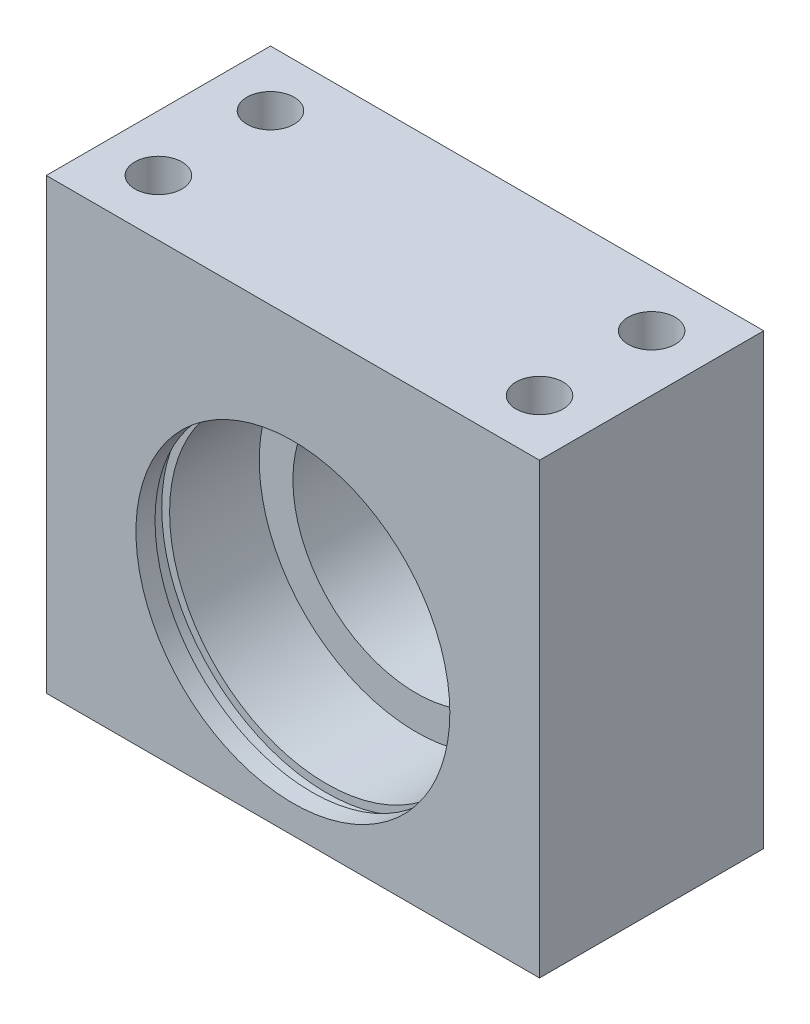
ISO-10303-21;
HEADER;
FILE_DESCRIPTION(('STEP AP214'),'2;1');
FILE_NAME('part.step','',(''),(''),'','','');
FILE_SCHEMA(('AUTOMOTIVE_DESIGN { 1 0 10303 214 1 1 1 1 }'));
ENDSEC;
DATA;
#1=APPLICATION_CONTEXT('core data for automotive mechanical design processes');
#2=APPLICATION_PROTOCOL_DEFINITION('international standard','automotive_design',2000,#1);
#3=PRODUCT_CONTEXT('',#1,'mechanical');
#4=PRODUCT('Part','Part','',(#3));
#5=PRODUCT_RELATED_PRODUCT_CATEGORY('part','',(#4));
#6=PRODUCT_DEFINITION_FORMATION('','',#4);
#7=PRODUCT_DEFINITION_CONTEXT('part definition',#1,'design');
#8=PRODUCT_DEFINITION('design','',#6,#7);
#9=PRODUCT_DEFINITION_SHAPE('','',#8);
#10=(LENGTH_UNIT() NAMED_UNIT(*) SI_UNIT(.MILLI.,.METRE.));
#11=(NAMED_UNIT(*) PLANE_ANGLE_UNIT() SI_UNIT($,.RADIAN.));
#12=(NAMED_UNIT(*) SI_UNIT($,.STERADIAN.) SOLID_ANGLE_UNIT());
#13=UNCERTAINTY_MEASURE_WITH_UNIT(LENGTH_MEASURE(1.E-05),#10,'distance_accuracy_value','');
#14=(GEOMETRIC_REPRESENTATION_CONTEXT(3) GLOBAL_UNCERTAINTY_ASSIGNED_CONTEXT((#13)) GLOBAL_UNIT_ASSIGNED_CONTEXT((#10,
#11,#12)) REPRESENTATION_CONTEXT('',''));
#15=CARTESIAN_POINT('',(0.,0.,0.));
#16=DIRECTION('',(0.,0.,1.));
#17=DIRECTION('',(1.,0.,0.));
#18=AXIS2_PLACEMENT_3D('',#15,#16,#17);
#19=CARTESIAN_POINT('',(0.,16.5,-0.999999999999997));
#20=DIRECTION('',(0.,0.,1.));
#21=DIRECTION('',(1.,0.,0.));
#22=AXIS2_PLACEMENT_3D('',#19,#20,#21);
#23=CYLINDRICAL_SURFACE('',#22,14.);
#24=CARTESIAN_POINT('',(0.,16.5,-0.999999999999997));
#25=DIRECTION('',(0.,0.,1.));
#26=DIRECTION('',(1.,0.,0.));
#27=AXIS2_PLACEMENT_3D('',#24,#25,#26);
#28=CIRCLE('',#27,14.);
#29=CARTESIAN_POINT('',(14.,16.5,-0.999999999999997));
#30=VERTEX_POINT('',#29);
#31=EDGE_CURVE('E130',#30,#30,#28,.T.);
#32=ORIENTED_EDGE('',*,*,#31,.F.);
#33=EDGE_LOOP('',(#32));
#34=FACE_BOUND('',#33,.T.);
#35=CARTESIAN_POINT('',(0.,16.5,7.));
#36=DIRECTION('',(0.,0.,-1.));
#37=DIRECTION('',(-1.,0.,0.));
#38=AXIS2_PLACEMENT_3D('',#35,#36,#37);
#39=CIRCLE('',#38,14.);
#40=CARTESIAN_POINT('',(-14.,16.5,7.));
#41=VERTEX_POINT('',#40);
#42=EDGE_CURVE('E255',#41,#41,#39,.T.);
#43=ORIENTED_EDGE('',*,*,#42,.F.);
#44=EDGE_LOOP('',(#43));
#45=FACE_BOUND('',#44,.T.);
#46=ADVANCED_FACE('F32',(#34,#45),#23,.F.);
#47=CARTESIAN_POINT('',(0.,16.5,10.));
#48=DIRECTION('',(0.,0.,1.));
#49=DIRECTION('',(1.,0.,0.));
#50=AXIS2_PLACEMENT_3D('',#47,#48,#49);
#51=CIRCLE('',#50,14.);
#52=CARTESIAN_POINT('',(14.,16.5,10.));
#53=VERTEX_POINT('',#52);
#54=EDGE_CURVE('E129',#53,#53,#51,.T.);
#55=ORIENTED_EDGE('',*,*,#54,.T.);
#56=EDGE_LOOP('',(#55));
#57=FACE_BOUND('',#56,.T.);
#58=CARTESIAN_POINT('',(0.,16.5,8.3));
#59=DIRECTION('',(0.,0.,-1.));
#60=DIRECTION('',(-1.,0.,0.));
#61=AXIS2_PLACEMENT_3D('',#58,#59,#60);
#62=CIRCLE('',#61,14.);
#63=CARTESIAN_POINT('',(-14.,16.5,8.3));
#64=VERTEX_POINT('',#63);
#65=EDGE_CURVE('E253',#64,#64,#62,.T.);
#66=ORIENTED_EDGE('',*,*,#65,.T.);
#67=EDGE_LOOP('',(#66));
#68=FACE_BOUND('',#67,.T.);
#69=ADVANCED_FACE('F179',(#57,#68),#23,.F.);
#70=CARTESIAN_POINT('',(0.,16.5,-10.));
#71=DIRECTION('',(0.,0.,1.));
#72=DIRECTION('',(1.,0.,0.));
#73=AXIS2_PLACEMENT_3D('',#70,#71,#72);
#74=CYLINDRICAL_SURFACE('',#73,11.);
#75=CARTESIAN_POINT('',(0.,16.5,-10.));
#76=DIRECTION('',(0.,0.,1.));
#77=DIRECTION('',(1.,0.,0.));
#78=AXIS2_PLACEMENT_3D('',#75,#76,#77);
#79=CIRCLE('',#78,11.);
#80=CARTESIAN_POINT('',(11.,16.5,-10.));
#81=VERTEX_POINT('',#80);
#82=EDGE_CURVE('E135',#81,#81,#79,.T.);
#83=ORIENTED_EDGE('',*,*,#82,.F.);
#84=EDGE_LOOP('',(#83));
#85=FACE_BOUND('',#84,.T.);
#86=CARTESIAN_POINT('',(0.,16.5,-0.999999999999997));
#87=DIRECTION('',(0.,0.,1.));
#88=DIRECTION('',(1.,0.,0.));
#89=AXIS2_PLACEMENT_3D('',#86,#87,#88);
#90=CIRCLE('',#89,11.);
#91=CARTESIAN_POINT('',(11.,16.5,-0.999999999999997));
#92=VERTEX_POINT('',#91);
#93=EDGE_CURVE('E36',#92,#92,#90,.F.);
#94=ORIENTED_EDGE('',*,*,#93,.F.);
#95=EDGE_LOOP('',(#94));
#96=FACE_BOUND('',#95,.T.);
#97=ADVANCED_FACE('F185',(#85,#96),#74,.F.);
#98=CARTESIAN_POINT('',(22.,40.,10.));
#99=DIRECTION('',(-1.,0.,0.));
#100=DIRECTION('',(0.,0.,1.));
#101=AXIS2_PLACEMENT_3D('',#98,#99,#100);
#102=PLANE('',#101);
#103=DIRECTION('',(0.,0.,-1.));
#104=VECTOR('',#103,1.);
#105=CARTESIAN_POINT('',(22.,0.,10.));
#106=LINE('',#105,#104);
#107=CARTESIAN_POINT('',(22.,0.,10.));
#108=VERTEX_POINT('',#107);
#109=CARTESIAN_POINT('',(22.,0.,-10.));
#110=VERTEX_POINT('',#109);
#111=EDGE_CURVE('E138',#108,#110,#106,.T.);
#112=ORIENTED_EDGE('',*,*,#111,.T.);
#113=DIRECTION('',(0.,-1.,0.));
#114=VECTOR('',#113,1.);
#115=CARTESIAN_POINT('',(22.,40.,-10.));
#116=LINE('',#115,#114);
#117=CARTESIAN_POINT('',(22.,40.,-10.));
#118=VERTEX_POINT('',#117);
#119=EDGE_CURVE('E11',#118,#110,#116,.T.);
#120=ORIENTED_EDGE('',*,*,#119,.F.);
#121=DIRECTION('',(0.,0.,-1.));
#122=VECTOR('',#121,1.);
#123=CARTESIAN_POINT('',(22.,40.,10.));
#124=LINE('',#123,#122);
#125=CARTESIAN_POINT('',(22.,40.,10.));
#126=VERTEX_POINT('',#125);
#127=EDGE_CURVE('E139',#126,#118,#124,.T.);
#128=ORIENTED_EDGE('',*,*,#127,.F.);
#129=DIRECTION('',(0.,-1.,0.));
#130=VECTOR('',#129,1.);
#131=CARTESIAN_POINT('',(22.,40.,10.));
#132=LINE('',#131,#130);
#133=EDGE_CURVE('E145',#126,#108,#132,.T.);
#134=ORIENTED_EDGE('',*,*,#133,.T.);
#135=EDGE_LOOP('',(#112,#120,#128,#134));
#136=FACE_BOUND('',#135,.T.);
#137=ADVANCED_FACE('F34',(#136),#102,.F.);
#138=CARTESIAN_POINT('',(-22.,40.,-10.));
#139=DIRECTION('',(0.,0.,1.));
#140=DIRECTION('',(1.,0.,0.));
#141=AXIS2_PLACEMENT_3D('',#138,#139,#140);
#142=PLANE('',#141);
#143=ORIENTED_EDGE('',*,*,#82,.T.);
#144=EDGE_LOOP('',(#143));
#145=FACE_BOUND('',#144,.T.);
#146=DIRECTION('',(-1.,0.,0.));
#147=VECTOR('',#146,1.);
#148=CARTESIAN_POINT('',(-22.,0.,-10.));
#149=LINE('',#148,#147);
#150=CARTESIAN_POINT('',(-22.,0.,-10.));
#151=VERTEX_POINT('',#150);
#152=EDGE_CURVE('E148',#110,#151,#149,.T.);
#153=ORIENTED_EDGE('',*,*,#152,.T.);
#154=DIRECTION('',(0.,-1.,0.));
#155=VECTOR('',#154,1.);
#156=CARTESIAN_POINT('',(-22.,40.,-10.));
#157=LINE('',#156,#155);
#158=CARTESIAN_POINT('',(-22.,40.,-10.));
#159=VERTEX_POINT('',#158);
#160=EDGE_CURVE('E42',#159,#151,#157,.T.);
#161=ORIENTED_EDGE('',*,*,#160,.F.);
#162=DIRECTION('',(-1.,0.,0.));
#163=VECTOR('',#162,1.);
#164=CARTESIAN_POINT('',(-22.,40.,-10.));
#165=LINE('',#164,#163);
#166=EDGE_CURVE('E81',#118,#159,#165,.T.);
#167=ORIENTED_EDGE('',*,*,#166,.F.);
#168=ORIENTED_EDGE('',*,*,#119,.T.);
#169=EDGE_LOOP('',(#153,#161,#167,#168));
#170=FACE_BOUND('',#169,.T.);
#171=ADVANCED_FACE('F174',(#145,#170),#142,.F.);
#172=CARTESIAN_POINT('',(-22.,40.,10.));
#173=DIRECTION('',(1.,0.,0.));
#174=DIRECTION('',(0.,0.,-1.));
#175=AXIS2_PLACEMENT_3D('',#172,#173,#174);
#176=PLANE('',#175);
#177=DIRECTION('',(0.,0.,1.));
#178=VECTOR('',#177,1.);
#179=CARTESIAN_POINT('',(-22.,0.,10.));
#180=LINE('',#179,#178);
#181=CARTESIAN_POINT('',(-22.,0.,10.));
#182=VERTEX_POINT('',#181);
#183=EDGE_CURVE('E68',#151,#182,#180,.T.);
#184=ORIENTED_EDGE('',*,*,#183,.T.);
#185=DIRECTION('',(0.,-1.,0.));
#186=VECTOR('',#185,1.);
#187=CARTESIAN_POINT('',(-22.,40.,10.));
#188=LINE('',#187,#186);
#189=CARTESIAN_POINT('',(-22.,40.,10.));
#190=VERTEX_POINT('',#189);
#191=EDGE_CURVE('E153',#190,#182,#188,.T.);
#192=ORIENTED_EDGE('',*,*,#191,.F.);
#193=DIRECTION('',(0.,0.,1.));
#194=VECTOR('',#193,1.);
#195=CARTESIAN_POINT('',(-22.,40.,10.));
#196=LINE('',#195,#194);
#197=EDGE_CURVE('E142',#159,#190,#196,.T.);
#198=ORIENTED_EDGE('',*,*,#197,.F.);
#199=ORIENTED_EDGE('',*,*,#160,.T.);
#200=EDGE_LOOP('',(#184,#192,#198,#199));
#201=FACE_BOUND('',#200,.T.);
#202=ADVANCED_FACE('F156',(#201),#176,.F.);
#203=CARTESIAN_POINT('',(-22.,40.,10.));
#204=DIRECTION('',(0.,0.,-1.));
#205=DIRECTION('',(-1.,0.,0.));
#206=AXIS2_PLACEMENT_3D('',#203,#204,#205);
#207=PLANE('',#206);
#208=ORIENTED_EDGE('',*,*,#54,.F.);
#209=EDGE_LOOP('',(#208));
#210=FACE_BOUND('',#209,.T.);
#211=DIRECTION('',(1.,0.,0.));
#212=VECTOR('',#211,1.);
#213=CARTESIAN_POINT('',(-22.,0.,10.));
#214=LINE('',#213,#212);
#215=EDGE_CURVE('E74',#182,#108,#214,.T.);
#216=ORIENTED_EDGE('',*,*,#215,.T.);
#217=ORIENTED_EDGE('',*,*,#133,.F.);
#218=DIRECTION('',(1.,0.,0.));
#219=VECTOR('',#218,1.);
#220=CARTESIAN_POINT('',(-22.,40.,10.));
#221=LINE('',#220,#219);
#222=EDGE_CURVE('E50',#190,#126,#221,.T.);
#223=ORIENTED_EDGE('',*,*,#222,.F.);
#224=ORIENTED_EDGE('',*,*,#191,.T.);
#225=EDGE_LOOP('',(#216,#217,#223,#224));
#226=FACE_BOUND('',#225,.T.);
#227=ADVANCED_FACE('F163',(#210,#226),#207,.F.);
#228=CARTESIAN_POINT('',(0.,40.,0.));
#229=DIRECTION('',(0.,-1.,0.));
#230=DIRECTION('',(0.,0.,-1.));
#231=AXIS2_PLACEMENT_3D('',#228,#229,#230);
#232=PLANE('',#231);
#233=CARTESIAN_POINT('',(17.,40.,-5.));
#234=DIRECTION('',(0.,1.,0.));
#235=DIRECTION('',(0.,0.,1.));
#236=AXIS2_PLACEMENT_3D('',#233,#234,#235);
#237=CIRCLE('',#236,2.09999999999999);
#238=CARTESIAN_POINT('',(17.,40.,-2.90000000000001));
#239=VERTEX_POINT('',#238);
#240=EDGE_CURVE('E105',#239,#239,#237,.T.);
#241=ORIENTED_EDGE('',*,*,#240,.F.);
#242=EDGE_LOOP('',(#241));
#243=FACE_BOUND('',#242,.T.);
#244=CARTESIAN_POINT('',(17.,40.,5.));
#245=DIRECTION('',(0.,1.,0.));
#246=DIRECTION('',(0.,0.,1.));
#247=AXIS2_PLACEMENT_3D('',#244,#245,#246);
#248=CIRCLE('',#247,2.09999999999999);
#249=CARTESIAN_POINT('',(17.,40.,7.09999999999999));
#250=VERTEX_POINT('',#249);
#251=EDGE_CURVE('E104',#250,#250,#248,.T.);
#252=ORIENTED_EDGE('',*,*,#251,.F.);
#253=EDGE_LOOP('',(#252));
#254=FACE_BOUND('',#253,.T.);
#255=CARTESIAN_POINT('',(-17.,40.,5.));
#256=DIRECTION('',(0.,1.,0.));
#257=DIRECTION('',(0.,0.,1.));
#258=AXIS2_PLACEMENT_3D('',#255,#256,#257);
#259=CIRCLE('',#258,2.09999999999999);
#260=CARTESIAN_POINT('',(-17.,40.,7.09999999999999));
#261=VERTEX_POINT('',#260);
#262=EDGE_CURVE('E117',#261,#261,#259,.T.);
#263=ORIENTED_EDGE('',*,*,#262,.F.);
#264=EDGE_LOOP('',(#263));
#265=FACE_BOUND('',#264,.T.);
#266=CARTESIAN_POINT('',(-17.,40.,-5.));
#267=DIRECTION('',(0.,1.,0.));
#268=DIRECTION('',(0.,0.,1.));
#269=AXIS2_PLACEMENT_3D('',#266,#267,#268);
#270=CIRCLE('',#269,2.09999999999999);
#271=CARTESIAN_POINT('',(-17.,40.,-2.90000000000001));
#272=VERTEX_POINT('',#271);
#273=EDGE_CURVE('E123',#272,#272,#270,.T.);
#274=ORIENTED_EDGE('',*,*,#273,.F.);
#275=EDGE_LOOP('',(#274));
#276=FACE_BOUND('',#275,.T.);
#277=ORIENTED_EDGE('',*,*,#127,.T.);
#278=ORIENTED_EDGE('',*,*,#166,.T.);
#279=ORIENTED_EDGE('',*,*,#197,.T.);
#280=ORIENTED_EDGE('',*,*,#222,.T.);
#281=EDGE_LOOP('',(#277,#278,#279,#280));
#282=FACE_BOUND('',#281,.T.);
#283=ADVANCED_FACE('F165',(#243,#254,#265,#276,#282),#232,.F.);
#284=CARTESIAN_POINT('',(0.,0.,0.));
#285=DIRECTION('',(0.,-1.,0.));
#286=DIRECTION('',(0.,0.,-1.));
#287=AXIS2_PLACEMENT_3D('',#284,#285,#286);
#288=PLANE('',#287);
#289=ORIENTED_EDGE('',*,*,#111,.F.);
#290=ORIENTED_EDGE('',*,*,#215,.F.);
#291=ORIENTED_EDGE('',*,*,#183,.F.);
#292=ORIENTED_EDGE('',*,*,#152,.F.);
#293=EDGE_LOOP('',(#289,#290,#291,#292));
#294=FACE_BOUND('',#293,.T.);
#295=ADVANCED_FACE('F159',(#294),#288,.T.);
#296=CARTESIAN_POINT('',(0.,16.5,-0.999999999999997));
#297=DIRECTION('',(0.,0.,1.));
#298=DIRECTION('',(1.,0.,0.));
#299=AXIS2_PLACEMENT_3D('',#296,#297,#298);
#300=PLANE('',#299);
#301=ORIENTED_EDGE('',*,*,#31,.T.);
#302=EDGE_LOOP('',(#301));
#303=FACE_BOUND('',#302,.T.);
#304=ORIENTED_EDGE('',*,*,#93,.T.);
#305=EDGE_LOOP('',(#304));
#306=FACE_BOUND('',#305,.T.);
#307=ADVANCED_FACE('F191',(#303,#306),#300,.T.);
#308=CARTESIAN_POINT('',(-17.,15.,-5.));
#309=DIRECTION('',(0.,1.,0.));
#310=DIRECTION('',(0.,0.,1.));
#311=AXIS2_PLACEMENT_3D('',#308,#309,#310);
#312=CONICAL_SURFACE('',#311,2.09999999999999,1.02974425867665);
#313=CARTESIAN_POINT('',(-17.,13.7381927000421,-5.));
#314=VERTEX_POINT('',#313);
#315=VERTEX_LOOP('',#314);
#316=FACE_BOUND('',#315,.T.);
#317=CARTESIAN_POINT('',(-17.,15.,-5.));
#318=DIRECTION('',(0.,1.,0.));
#319=DIRECTION('',(0.,0.,1.));
#320=AXIS2_PLACEMENT_3D('',#317,#318,#319);
#321=CIRCLE('',#320,2.09999999999999);
#322=CARTESIAN_POINT('',(-17.,15.,-2.9));
#323=VERTEX_POINT('',#322);
#324=EDGE_CURVE('E126',#323,#323,#321,.T.);
#325=ORIENTED_EDGE('',*,*,#324,.T.);
#326=EDGE_LOOP('',(#325));
#327=FACE_BOUND('',#326,.T.);
#328=ADVANCED_FACE('F199',(#316,#327),#312,.F.);
#329=CARTESIAN_POINT('',(-17.,40.,-5.));
#330=DIRECTION('',(0.,1.,0.));
#331=DIRECTION('',(0.,0.,1.));
#332=AXIS2_PLACEMENT_3D('',#329,#330,#331);
#333=CYLINDRICAL_SURFACE('',#332,2.09999999999999);
#334=ORIENTED_EDGE('',*,*,#324,.F.);
#335=EDGE_LOOP('',(#334));
#336=FACE_BOUND('',#335,.T.);
#337=ORIENTED_EDGE('',*,*,#273,.T.);
#338=EDGE_LOOP('',(#337));
#339=FACE_BOUND('',#338,.T.);
#340=ADVANCED_FACE('F204',(#336,#339),#333,.F.);
#341=CARTESIAN_POINT('',(-17.,15.,5.));
#342=DIRECTION('',(0.,1.,0.));
#343=DIRECTION('',(0.,0.,1.));
#344=AXIS2_PLACEMENT_3D('',#341,#342,#343);
#345=CONICAL_SURFACE('',#344,2.09999999999999,1.02974425867665);
#346=CARTESIAN_POINT('',(-17.,13.7381927000421,5.));
#347=VERTEX_POINT('',#346);
#348=VERTEX_LOOP('',#347);
#349=FACE_BOUND('',#348,.T.);
#350=CARTESIAN_POINT('',(-17.,15.,5.));
#351=DIRECTION('',(0.,1.,0.));
#352=DIRECTION('',(0.,0.,1.));
#353=AXIS2_PLACEMENT_3D('',#350,#351,#352);
#354=CIRCLE('',#353,2.09999999999999);
#355=CARTESIAN_POINT('',(-17.,15.,7.1));
#356=VERTEX_POINT('',#355);
#357=EDGE_CURVE('E120',#356,#356,#354,.T.);
#358=ORIENTED_EDGE('',*,*,#357,.T.);
#359=EDGE_LOOP('',(#358));
#360=FACE_BOUND('',#359,.T.);
#361=ADVANCED_FACE('F213',(#349,#360),#345,.F.);
#362=CARTESIAN_POINT('',(-17.,40.,5.));
#363=DIRECTION('',(0.,1.,0.));
#364=DIRECTION('',(0.,0.,1.));
#365=AXIS2_PLACEMENT_3D('',#362,#363,#364);
#366=CYLINDRICAL_SURFACE('',#365,2.09999999999999);
#367=ORIENTED_EDGE('',*,*,#357,.F.);
#368=EDGE_LOOP('',(#367));
#369=FACE_BOUND('',#368,.T.);
#370=ORIENTED_EDGE('',*,*,#262,.T.);
#371=EDGE_LOOP('',(#370));
#372=FACE_BOUND('',#371,.T.);
#373=ADVANCED_FACE('F220',(#369,#372),#366,.F.);
#374=CARTESIAN_POINT('',(17.,15.,5.));
#375=DIRECTION('',(0.,1.,0.));
#376=DIRECTION('',(0.,0.,1.));
#377=AXIS2_PLACEMENT_3D('',#374,#375,#376);
#378=CONICAL_SURFACE('',#377,2.09999999999999,1.02974425867665);
#379=CARTESIAN_POINT('',(17.,13.7381927000421,5.));
#380=VERTEX_POINT('',#379);
#381=VERTEX_LOOP('',#380);
#382=FACE_BOUND('',#381,.T.);
#383=CARTESIAN_POINT('',(17.,15.,5.));
#384=DIRECTION('',(0.,1.,0.));
#385=DIRECTION('',(0.,0.,1.));
#386=AXIS2_PLACEMENT_3D('',#383,#384,#385);
#387=CIRCLE('',#386,2.09999999999999);
#388=CARTESIAN_POINT('',(17.,15.,7.1));
#389=VERTEX_POINT('',#388);
#390=EDGE_CURVE('E108',#389,#389,#387,.T.);
#391=ORIENTED_EDGE('',*,*,#390,.T.);
#392=EDGE_LOOP('',(#391));
#393=FACE_BOUND('',#392,.T.);
#394=ADVANCED_FACE('F224',(#382,#393),#378,.F.);
#395=CARTESIAN_POINT('',(17.,40.,5.));
#396=DIRECTION('',(0.,1.,0.));
#397=DIRECTION('',(0.,0.,1.));
#398=AXIS2_PLACEMENT_3D('',#395,#396,#397);
#399=CYLINDRICAL_SURFACE('',#398,2.09999999999999);
#400=ORIENTED_EDGE('',*,*,#390,.F.);
#401=EDGE_LOOP('',(#400));
#402=FACE_BOUND('',#401,.T.);
#403=ORIENTED_EDGE('',*,*,#251,.T.);
#404=EDGE_LOOP('',(#403));
#405=FACE_BOUND('',#404,.T.);
#406=ADVANCED_FACE('F98',(#402,#405),#399,.F.);
#407=CARTESIAN_POINT('',(17.,15.,-5.));
#408=DIRECTION('',(0.,1.,0.));
#409=DIRECTION('',(0.,0.,1.));
#410=AXIS2_PLACEMENT_3D('',#407,#408,#409);
#411=CONICAL_SURFACE('',#410,2.09999999999999,1.02974425867665);
#412=CARTESIAN_POINT('',(17.,13.7381927000421,-5.));
#413=VERTEX_POINT('',#412);
#414=VERTEX_LOOP('',#413);
#415=FACE_BOUND('',#414,.T.);
#416=CARTESIAN_POINT('',(17.,15.,-5.));
#417=DIRECTION('',(0.,1.,0.));
#418=DIRECTION('',(0.,0.,1.));
#419=AXIS2_PLACEMENT_3D('',#416,#417,#418);
#420=CIRCLE('',#419,2.09999999999999);
#421=CARTESIAN_POINT('',(17.,15.,-2.9));
#422=VERTEX_POINT('',#421);
#423=EDGE_CURVE('E102',#422,#422,#420,.T.);
#424=ORIENTED_EDGE('',*,*,#423,.T.);
#425=EDGE_LOOP('',(#424));
#426=FACE_BOUND('',#425,.T.);
#427=ADVANCED_FACE('F94',(#415,#426),#411,.F.);
#428=CARTESIAN_POINT('',(17.,40.,-5.));
#429=DIRECTION('',(0.,1.,0.));
#430=DIRECTION('',(0.,0.,1.));
#431=AXIS2_PLACEMENT_3D('',#428,#429,#430);
#432=CYLINDRICAL_SURFACE('',#431,2.09999999999999);
#433=ORIENTED_EDGE('',*,*,#423,.F.);
#434=EDGE_LOOP('',(#433));
#435=FACE_BOUND('',#434,.T.);
#436=ORIENTED_EDGE('',*,*,#240,.T.);
#437=EDGE_LOOP('',(#436));
#438=FACE_BOUND('',#437,.T.);
#439=ADVANCED_FACE('F97',(#435,#438),#432,.F.);
#440=CARTESIAN_POINT('',(0.,2.5,7.));
#441=DIRECTION('',(0.,0.,1.));
#442=DIRECTION('',(1.,0.,0.));
#443=AXIS2_PLACEMENT_3D('',#440,#441,#442);
#444=PLANE('',#443);
#445=ORIENTED_EDGE('',*,*,#42,.T.);
#446=EDGE_LOOP('',(#445));
#447=FACE_BOUND('',#446,.T.);
#448=CARTESIAN_POINT('',(0.,16.5,7.));
#449=DIRECTION('',(0.,0.,-1.));
#450=DIRECTION('',(-1.,0.,0.));
#451=AXIS2_PLACEMENT_3D('',#448,#449,#450);
#452=CIRCLE('',#451,14.7);
#453=CARTESIAN_POINT('',(-14.7,16.5,7.));
#454=VERTEX_POINT('',#453);
#455=EDGE_CURVE('E111',#454,#454,#452,.T.);
#456=ORIENTED_EDGE('',*,*,#455,.F.);
#457=EDGE_LOOP('',(#456));
#458=FACE_BOUND('',#457,.T.);
#459=ADVANCED_FACE('F234',(#447,#458),#444,.T.);
#460=CARTESIAN_POINT('',(0.,16.5,9.29464911712332));
#461=DIRECTION('',(0.,0.,-1.));
#462=DIRECTION('',(-1.,0.,0.));
#463=AXIS2_PLACEMENT_3D('',#460,#461,#462);
#464=CYLINDRICAL_SURFACE('',#463,14.7);
#465=ORIENTED_EDGE('',*,*,#455,.T.);
#466=EDGE_LOOP('',(#465));
#467=FACE_BOUND('',#466,.T.);
#468=CARTESIAN_POINT('',(0.,16.5,8.3));
#469=DIRECTION('',(0.,0.,-1.));
#470=DIRECTION('',(-1.,0.,0.));
#471=AXIS2_PLACEMENT_3D('',#468,#469,#470);
#472=CIRCLE('',#471,14.7);
#473=CARTESIAN_POINT('',(-14.7,16.5,8.3));
#474=VERTEX_POINT('',#473);
#475=EDGE_CURVE('E250',#474,#474,#472,.T.);
#476=ORIENTED_EDGE('',*,*,#475,.F.);
#477=EDGE_LOOP('',(#476));
#478=FACE_BOUND('',#477,.T.);
#479=ADVANCED_FACE('F237',(#467,#478),#464,.F.);
#480=CARTESIAN_POINT('',(0.,2.5,8.3));
#481=DIRECTION('',(0.,0.,-1.));
#482=DIRECTION('',(-1.,0.,0.));
#483=AXIS2_PLACEMENT_3D('',#480,#481,#482);
#484=PLANE('',#483);
#485=ORIENTED_EDGE('',*,*,#475,.T.);
#486=EDGE_LOOP('',(#485));
#487=FACE_BOUND('',#486,.T.);
#488=ORIENTED_EDGE('',*,*,#65,.F.);
#489=EDGE_LOOP('',(#488));
#490=FACE_BOUND('',#489,.T.);
#491=ADVANCED_FACE('F241',(#487,#490),#484,.T.);
#492=CLOSED_SHELL('',(#46,#69,#97,#137,#171,#202,#227,#283,#295,#307,#328,#340,#361,#373,#394,
#406,#427,#439,#459,#479,#491));
#493=MANIFOLD_SOLID_BREP('B2',#492);
#494=ADVANCED_BREP_SHAPE_REPRESENTATION('',(#18,#493),#14);
#495=SHAPE_DEFINITION_REPRESENTATION(#9,#494);
ENDSEC;
END-ISO-10303-21;
